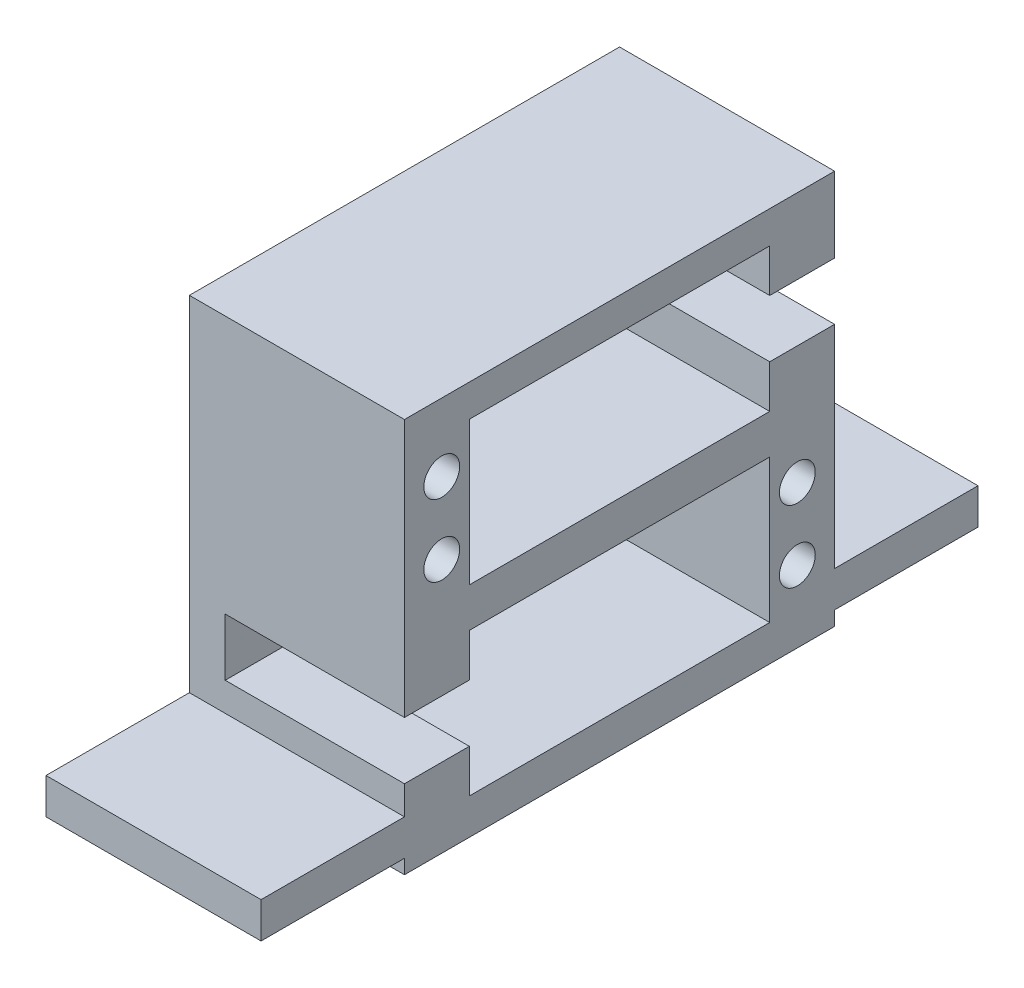
ISO-10303-21;
HEADER;
FILE_DESCRIPTION(('STEP AP214'),'2;1');
FILE_NAME('part.step','',(''),(''),'','','');
FILE_SCHEMA(('AUTOMOTIVE_DESIGN { 1 0 10303 214 1 1 1 1 }'));
ENDSEC;
DATA;
#1=APPLICATION_CONTEXT('core data for automotive mechanical design processes');
#2=APPLICATION_PROTOCOL_DEFINITION('international standard','automotive_design',2000,#1);
#3=PRODUCT_CONTEXT('',#1,'mechanical');
#4=PRODUCT('Part','Part','',(#3));
#5=PRODUCT_RELATED_PRODUCT_CATEGORY('part','',(#4));
#6=PRODUCT_DEFINITION_FORMATION('','',#4);
#7=PRODUCT_DEFINITION_CONTEXT('part definition',#1,'design');
#8=PRODUCT_DEFINITION('design','',#6,#7);
#9=PRODUCT_DEFINITION_SHAPE('','',#8);
#10=(LENGTH_UNIT() NAMED_UNIT(*) SI_UNIT(.MILLI.,.METRE.));
#11=(NAMED_UNIT(*) PLANE_ANGLE_UNIT() SI_UNIT($,.RADIAN.));
#12=(NAMED_UNIT(*) SI_UNIT($,.STERADIAN.) SOLID_ANGLE_UNIT());
#13=UNCERTAINTY_MEASURE_WITH_UNIT(LENGTH_MEASURE(1.E-05),#10,'distance_accuracy_value','');
#14=(GEOMETRIC_REPRESENTATION_CONTEXT(3) GLOBAL_UNCERTAINTY_ASSIGNED_CONTEXT((#13)) GLOBAL_UNIT_ASSIGNED_CONTEXT((#10,
#11,#12)) REPRESENTATION_CONTEXT('',''));
#15=CARTESIAN_POINT('',(0.,0.,0.));
#16=DIRECTION('',(0.,0.,1.));
#17=DIRECTION('',(1.,0.,0.));
#18=AXIS2_PLACEMENT_3D('',#15,#16,#17);
#19=CARTESIAN_POINT('',(4.12598425196847,25.,13.5877952755906));
#20=DIRECTION('',(0.,0.,1.));
#21=DIRECTION('',(0.,-1.,0.));
#22=AXIS2_PLACEMENT_3D('',#19,#20,#21);
#23=PLANE('',#22);
#24=DIRECTION('',(-1.,0.,0.));
#25=VECTOR('',#24,1.);
#26=CARTESIAN_POINT('',(29.1259842519685,5.,13.5877952755906));
#27=LINE('',#26,#25);
#28=CARTESIAN_POINT('',(29.1259842519685,5.,13.5877952755906));
#29=VERTEX_POINT('',#28);
#30=CARTESIAN_POINT('',(4.12598425196847,5.,13.5877952755906));
#31=VERTEX_POINT('',#30);
#32=EDGE_CURVE('E69',#29,#31,#27,.T.);
#33=ORIENTED_EDGE('',*,*,#32,.T.);
#34=DIRECTION('',(0.,-1.,0.));
#35=VECTOR('',#34,1.);
#36=CARTESIAN_POINT('',(4.12598425196847,25.,13.5877952755906));
#37=LINE('',#36,#35);
#38=CARTESIAN_POINT('',(4.12598425196847,11.,13.5877952755906));
#39=VERTEX_POINT('',#38);
#40=EDGE_CURVE('E475',#39,#31,#37,.T.);
#41=ORIENTED_EDGE('',*,*,#40,.F.);
#42=DIRECTION('',(1.,0.,0.));
#43=VECTOR('',#42,1.);
#44=CARTESIAN_POINT('',(4.12598425196847,11.,13.5877952755906));
#45=LINE('',#44,#43);
#46=CARTESIAN_POINT('',(29.1259842519685,11.,13.5877952755906));
#47=VERTEX_POINT('',#46);
#48=EDGE_CURVE('E395',#39,#47,#45,.T.);
#49=ORIENTED_EDGE('',*,*,#48,.T.);
#50=DIRECTION('',(0.,1.,0.));
#51=VECTOR('',#50,1.);
#52=CARTESIAN_POINT('',(29.1259842519685,25.,13.5877952755906));
#53=LINE('',#52,#51);
#54=EDGE_CURVE('E335',#29,#47,#53,.T.);
#55=ORIENTED_EDGE('',*,*,#54,.F.);
#56=EDGE_LOOP('',(#33,#41,#49,#55));
#57=FACE_BOUND('',#56,.T.);
#58=ADVANCED_FACE('F45',(#57),#23,.F.);
#59=CARTESIAN_POINT('',(4.12598425196847,25.,-28.3122047244094));
#60=DIRECTION('',(0.,0.,-1.));
#61=DIRECTION('',(-1.,0.,0.));
#62=AXIS2_PLACEMENT_3D('',#59,#60,#61);
#63=PLANE('',#62);
#64=DIRECTION('',(-1.,0.,0.));
#65=VECTOR('',#64,1.);
#66=CARTESIAN_POINT('',(29.1259842519685,5.,-28.3122047244094));
#67=LINE('',#66,#65);
#68=CARTESIAN_POINT('',(29.1259842519685,5.,-28.3122047244094));
#69=VERTEX_POINT('',#68);
#70=CARTESIAN_POINT('',(4.12598425196847,5.,-28.3122047244094));
#71=VERTEX_POINT('',#70);
#72=EDGE_CURVE('E559',#69,#71,#67,.T.);
#73=ORIENTED_EDGE('',*,*,#72,.F.);
#74=DIRECTION('',(0.,-1.,0.));
#75=VECTOR('',#74,1.);
#76=CARTESIAN_POINT('',(29.1259842519685,25.,-28.3122047244094));
#77=LINE('',#76,#75);
#78=CARTESIAN_POINT('',(29.1259842519685,25.,-28.3122047244094));
#79=VERTEX_POINT('',#78);
#80=EDGE_CURVE('E338',#79,#69,#77,.T.);
#81=ORIENTED_EDGE('',*,*,#80,.F.);
#82=DIRECTION('',(1.,0.,0.));
#83=VECTOR('',#82,1.);
#84=CARTESIAN_POINT('',(4.12598425196847,25.,-28.3122047244094));
#85=LINE('',#84,#83);
#86=CARTESIAN_POINT('',(4.12598425196847,25.,-28.3122047244094));
#87=VERTEX_POINT('',#86);
#88=EDGE_CURVE('E461',#87,#79,#85,.T.);
#89=ORIENTED_EDGE('',*,*,#88,.F.);
#90=DIRECTION('',(0.,1.,0.));
#91=VECTOR('',#90,1.);
#92=CARTESIAN_POINT('',(4.12598425196847,25.,-28.3122047244094));
#93=LINE('',#92,#91);
#94=EDGE_CURVE('E472',#71,#87,#93,.T.);
#95=ORIENTED_EDGE('',*,*,#94,.F.);
#96=EDGE_LOOP('',(#73,#81,#89,#95));
#97=FACE_BOUND('',#96,.T.);
#98=ADVANCED_FACE('F557',(#97),#63,.F.);
#99=CARTESIAN_POINT('',(4.12598425196847,0.,0.));
#100=DIRECTION('',(1.,0.,0.));
#101=DIRECTION('',(0.,0.,-1.));
#102=AXIS2_PLACEMENT_3D('',#99,#100,#101);
#103=PLANE('',#102);
#104=ORIENTED_EDGE('',*,*,#40,.T.);
#105=DIRECTION('',(0.,0.,1.));
#106=VECTOR('',#105,1.);
#107=CARTESIAN_POINT('',(4.12598425196847,5.,13.5877952755906));
#108=LINE('',#107,#106);
#109=EDGE_CURVE('E61',#71,#31,#108,.T.);
#110=ORIENTED_EDGE('',*,*,#109,.F.);
#111=ORIENTED_EDGE('',*,*,#94,.T.);
#112=DIRECTION('',(0.,0.,1.));
#113=VECTOR('',#112,1.);
#114=CARTESIAN_POINT('',(4.12598425196847,25.,13.5877952755906));
#115=LINE('',#114,#113);
#116=CARTESIAN_POINT('',(4.12598425196847,25.,13.5877952755906));
#117=VERTEX_POINT('',#116);
#118=EDGE_CURVE('E465',#87,#117,#115,.T.);
#119=ORIENTED_EDGE('',*,*,#118,.T.);
#120=CARTESIAN_POINT('',(4.12598425196847,19.,13.5877952755906));
#121=VERTEX_POINT('',#120);
#122=EDGE_CURVE('E431',#117,#121,#37,.T.);
#123=ORIENTED_EDGE('',*,*,#122,.T.);
#124=DIRECTION('',(0.,0.,1.));
#125=VECTOR('',#124,1.);
#126=CARTESIAN_POINT('',(4.12598425196847,19.,22.6377952755906));
#127=LINE('',#126,#125);
#128=CARTESIAN_POINT('',(4.12598425196847,19.,22.6377952755906));
#129=VERTEX_POINT('',#128);
#130=EDGE_CURVE('E381',#121,#129,#127,.T.);
#131=ORIENTED_EDGE('',*,*,#130,.T.);
#132=DIRECTION('',(0.,-1.,0.));
#133=VECTOR('',#132,1.);
#134=CARTESIAN_POINT('',(4.12598425196847,19.,22.6377952755906));
#135=LINE('',#134,#133);
#136=CARTESIAN_POINT('',(4.12598425196847,11.,22.6377952755906));
#137=VERTEX_POINT('',#136);
#138=EDGE_CURVE('E373',#129,#137,#135,.T.);
#139=ORIENTED_EDGE('',*,*,#138,.T.);
#140=DIRECTION('',(0.,0.,-1.));
#141=VECTOR('',#140,1.);
#142=CARTESIAN_POINT('',(4.12598425196847,11.,22.6377952755906));
#143=LINE('',#142,#141);
#144=EDGE_CURVE('E377',#137,#39,#143,.T.);
#145=ORIENTED_EDGE('',*,*,#144,.T.);
#146=EDGE_LOOP('',(#104,#110,#111,#119,#123,#131,#139,#145));
#147=FACE_BOUND('',#146,.T.);
#148=ADVANCED_FACE('F539',(#147),#103,.T.);
#149=CARTESIAN_POINT('',(-0.874015748031524,55.,22.6377952755906));
#150=DIRECTION('',(0.,0.,-1.));
#151=DIRECTION('',(-1.,0.,0.));
#152=AXIS2_PLACEMENT_3D('',#149,#150,#151);
#153=PLANE('',#152);
#154=DIRECTION('',(0.,-1.,0.));
#155=VECTOR('',#154,1.);
#156=CARTESIAN_POINT('',(-0.874015748031524,55.,22.6377952755906));
#157=LINE('',#156,#155);
#158=CARTESIAN_POINT('',(-0.874015748031524,55.,22.6377952755906));
#159=VERTEX_POINT('',#158);
#160=CARTESIAN_POINT('',(-0.874015748031524,7.,22.6377952755906));
#161=VERTEX_POINT('',#160);
#162=EDGE_CURVE('E54',#159,#161,#157,.T.);
#163=ORIENTED_EDGE('',*,*,#162,.T.);
#164=DIRECTION('',(1.,0.,0.));
#165=VECTOR('',#164,1.);
#166=CARTESIAN_POINT('',(-0.874015748031524,7.,22.6377952755906));
#167=LINE('',#166,#165);
#168=CARTESIAN_POINT('',(29.1259842519685,7.,22.6377952755906));
#169=VERTEX_POINT('',#168);
#170=EDGE_CURVE('E314',#161,#169,#167,.T.);
#171=ORIENTED_EDGE('',*,*,#170,.T.);
#172=DIRECTION('',(0.,-1.,0.));
#173=VECTOR('',#172,1.);
#174=CARTESIAN_POINT('',(29.1259842519685,55.,22.6377952755906));
#175=LINE('',#174,#173);
#176=CARTESIAN_POINT('',(29.1259842519685,11.,22.6377952755906));
#177=VERTEX_POINT('',#176);
#178=EDGE_CURVE('E323',#177,#169,#175,.T.);
#179=ORIENTED_EDGE('',*,*,#178,.F.);
#180=DIRECTION('',(1.,0.,0.));
#181=VECTOR('',#180,1.);
#182=CARTESIAN_POINT('',(4.12598425196847,11.,22.6377952755906));
#183=LINE('',#182,#181);
#184=EDGE_CURVE('E385',#137,#177,#183,.T.);
#185=ORIENTED_EDGE('',*,*,#184,.F.);
#186=ORIENTED_EDGE('',*,*,#138,.F.);
#187=DIRECTION('',(1.,0.,0.));
#188=VECTOR('',#187,1.);
#189=CARTESIAN_POINT('',(4.12598425196847,19.,22.6377952755906));
#190=LINE('',#189,#188);
#191=CARTESIAN_POINT('',(29.1259842519685,19.,22.6377952755906));
#192=VERTEX_POINT('',#191);
#193=EDGE_CURVE('E386',#129,#192,#190,.T.);
#194=ORIENTED_EDGE('',*,*,#193,.T.);
#195=CARTESIAN_POINT('',(29.1259842519685,55.,22.6377952755906));
#196=VERTEX_POINT('',#195);
#197=EDGE_CURVE('E319',#196,#192,#175,.T.);
#198=ORIENTED_EDGE('',*,*,#197,.F.);
#199=DIRECTION('',(1.,0.,0.));
#200=VECTOR('',#199,1.);
#201=CARTESIAN_POINT('',(-0.874015748031524,55.,22.6377952755906));
#202=LINE('',#201,#200);
#203=EDGE_CURVE('E483',#159,#196,#202,.T.);
#204=ORIENTED_EDGE('',*,*,#203,.F.);
#205=EDGE_LOOP('',(#163,#171,#179,#185,#186,#194,#198,#204));
#206=FACE_BOUND('',#205,.T.);
#207=ADVANCED_FACE('F534',(#206),#153,.F.);
#208=CARTESIAN_POINT('',(-0.874015748031532,55.,-37.3622047244094));
#209=DIRECTION('',(0.,0.,1.));
#210=DIRECTION('',(1.,0.,0.));
#211=AXIS2_PLACEMENT_3D('',#208,#209,#210);
#212=PLANE('',#211);
#213=DIRECTION('',(0.,1.,0.));
#214=VECTOR('',#213,1.);
#215=CARTESIAN_POINT('',(29.1259842519685,55.,-37.3622047244094));
#216=LINE('',#215,#214);
#217=CARTESIAN_POINT('',(29.1259842519685,7.,-37.3622047244094));
#218=VERTEX_POINT('',#217);
#219=CARTESIAN_POINT('',(29.1259842519685,36.5,-37.3622047244094));
#220=VERTEX_POINT('',#219);
#221=EDGE_CURVE('E332',#218,#220,#216,.T.);
#222=ORIENTED_EDGE('',*,*,#221,.F.);
#223=DIRECTION('',(-1.,0.,0.));
#224=VECTOR('',#223,1.);
#225=CARTESIAN_POINT('',(-0.874015748031532,7.,-37.3622047244094));
#226=LINE('',#225,#224);
#227=CARTESIAN_POINT('',(-0.874015748031524,7.,-37.3622047244094));
#228=VERTEX_POINT('',#227);
#229=EDGE_CURVE('E310',#218,#228,#226,.T.);
#230=ORIENTED_EDGE('',*,*,#229,.T.);
#231=DIRECTION('',(0.,-1.,0.));
#232=VECTOR('',#231,1.);
#233=CARTESIAN_POINT('',(-0.874015748031532,55.,-37.3622047244094));
#234=LINE('',#233,#232);
#235=CARTESIAN_POINT('',(-0.874015748031532,55.,-37.3622047244094));
#236=VERTEX_POINT('',#235);
#237=EDGE_CURVE('E501',#236,#228,#234,.T.);
#238=ORIENTED_EDGE('',*,*,#237,.F.);
#239=DIRECTION('',(-1.,0.,0.));
#240=VECTOR('',#239,1.);
#241=CARTESIAN_POINT('',(-0.874015748031532,55.,-37.3622047244094));
#242=LINE('',#241,#240);
#243=CARTESIAN_POINT('',(29.1259842519685,55.,-37.3622047244094));
#244=VERTEX_POINT('',#243);
#245=EDGE_CURVE('E488',#244,#236,#242,.T.);
#246=ORIENTED_EDGE('',*,*,#245,.F.);
#247=CARTESIAN_POINT('',(29.1259842519685,44.5,-37.3622047244094));
#248=VERTEX_POINT('',#247);
#249=EDGE_CURVE('E326',#248,#244,#216,.T.);
#250=ORIENTED_EDGE('',*,*,#249,.F.);
#251=DIRECTION('',(1.,0.,0.));
#252=VECTOR('',#251,1.);
#253=CARTESIAN_POINT('',(4.12598425196847,44.5,-37.3622047244094));
#254=LINE('',#253,#252);
#255=CARTESIAN_POINT('',(4.12598425196847,44.5,-37.3622047244094));
#256=VERTEX_POINT('',#255);
#257=EDGE_CURVE('E411',#256,#248,#254,.T.);
#258=ORIENTED_EDGE('',*,*,#257,.F.);
#259=DIRECTION('',(0.,1.,0.));
#260=VECTOR('',#259,1.);
#261=CARTESIAN_POINT('',(4.12598425196847,44.5,-37.3622047244094));
#262=LINE('',#261,#260);
#263=CARTESIAN_POINT('',(4.12598425196847,36.5,-37.3622047244094));
#264=VERTEX_POINT('',#263);
#265=EDGE_CURVE('E420',#264,#256,#262,.T.);
#266=ORIENTED_EDGE('',*,*,#265,.F.);
#267=DIRECTION('',(1.,0.,0.));
#268=VECTOR('',#267,1.);
#269=CARTESIAN_POINT('',(4.12598425196847,36.5,-37.3622047244094));
#270=LINE('',#269,#268);
#271=EDGE_CURVE('E407',#264,#220,#270,.T.);
#272=ORIENTED_EDGE('',*,*,#271,.T.);
#273=EDGE_LOOP('',(#222,#230,#238,#246,#250,#258,#266,#272));
#274=FACE_BOUND('',#273,.T.);
#275=ADVANCED_FACE('F618',(#274),#212,.F.);
#276=DIRECTION('',(0.,1.,0.));
#277=VECTOR('',#276,1.);
#278=CARTESIAN_POINT('',(29.1259842519685,25.,13.5877952755906));
#279=LINE('',#278,#277);
#280=CARTESIAN_POINT('',(29.1259842519685,19.,13.5877952755906));
#281=VERTEX_POINT('',#280);
#282=CARTESIAN_POINT('',(29.1259842519685,25.,13.5877952755906));
#283=VERTEX_POINT('',#282);
#284=EDGE_CURVE('E345',#281,#283,#279,.T.);
#285=ORIENTED_EDGE('',*,*,#284,.F.);
#286=DIRECTION('',(1.,0.,0.));
#287=VECTOR('',#286,1.);
#288=CARTESIAN_POINT('',(4.12598425196847,19.,13.5877952755906));
#289=LINE('',#288,#287);
#290=EDGE_CURVE('E391',#121,#281,#289,.T.);
#291=ORIENTED_EDGE('',*,*,#290,.F.);
#292=ORIENTED_EDGE('',*,*,#122,.F.);
#293=DIRECTION('',(1.,0.,0.));
#294=VECTOR('',#293,1.);
#295=CARTESIAN_POINT('',(4.12598425196847,25.,13.5877952755906));
#296=LINE('',#295,#294);
#297=EDGE_CURVE('E390',#117,#283,#296,.T.);
#298=ORIENTED_EDGE('',*,*,#297,.T.);
#299=EDGE_LOOP('',(#285,#291,#292,#298));
#300=FACE_BOUND('',#299,.T.);
#301=ADVANCED_FACE('F548',(#300),#23,.F.);
#302=CARTESIAN_POINT('',(4.12598425196847,50.5,-28.3122047244094));
#303=DIRECTION('',(0.,0.,-1.));
#304=DIRECTION('',(-1.,0.,0.));
#305=AXIS2_PLACEMENT_3D('',#302,#303,#304);
#306=PLANE('',#305);
#307=DIRECTION('',(0.,-1.,0.));
#308=VECTOR('',#307,1.);
#309=CARTESIAN_POINT('',(29.1259842519685,50.5,-28.3122047244094));
#310=LINE('',#309,#308);
#311=CARTESIAN_POINT('',(29.1259842519685,50.5,-28.3122047244094));
#312=VERTEX_POINT('',#311);
#313=CARTESIAN_POINT('',(29.1259842519685,44.5,-28.3122047244094));
#314=VERTEX_POINT('',#313);
#315=EDGE_CURVE('E366',#312,#314,#310,.T.);
#316=ORIENTED_EDGE('',*,*,#315,.F.);
#317=DIRECTION('',(1.,0.,0.));
#318=VECTOR('',#317,1.);
#319=CARTESIAN_POINT('',(4.12598425196847,50.5,-28.3122047244094));
#320=LINE('',#319,#318);
#321=CARTESIAN_POINT('',(4.12598425196847,50.5,-28.3122047244094));
#322=VERTEX_POINT('',#321);
#323=EDGE_CURVE('E450',#322,#312,#320,.T.);
#324=ORIENTED_EDGE('',*,*,#323,.F.);
#325=DIRECTION('',(0.,1.,0.));
#326=VECTOR('',#325,1.);
#327=CARTESIAN_POINT('',(4.12598425196847,50.5,-28.3122047244094));
#328=LINE('',#327,#326);
#329=CARTESIAN_POINT('',(4.12598425196847,44.5,-28.3122047244094));
#330=VERTEX_POINT('',#329);
#331=EDGE_CURVE('E435',#330,#322,#328,.T.);
#332=ORIENTED_EDGE('',*,*,#331,.F.);
#333=DIRECTION('',(1.,0.,0.));
#334=VECTOR('',#333,1.);
#335=CARTESIAN_POINT('',(4.12598425196847,44.5,-28.3122047244094));
#336=LINE('',#335,#334);
#337=EDGE_CURVE('E372',#330,#314,#336,.T.);
#338=ORIENTED_EDGE('',*,*,#337,.T.);
#339=EDGE_LOOP('',(#316,#324,#332,#338));
#340=FACE_BOUND('',#339,.T.);
#341=ADVANCED_FACE('F617',(#340),#306,.F.);
#342=CARTESIAN_POINT('',(29.1259842519685,2.,22.6377952755906));
#343=VERTEX_POINT('',#342);
#344=CARTESIAN_POINT('',(29.1259842519685,0.,22.6377952755906));
#345=VERTEX_POINT('',#344);
#346=EDGE_CURVE('E318',#343,#345,#175,.T.);
#347=ORIENTED_EDGE('',*,*,#346,.F.);
#348=DIRECTION('',(-1.,0.,0.));
#349=VECTOR('',#348,1.);
#350=CARTESIAN_POINT('',(-0.874015748031524,2.,22.6377952755906));
#351=LINE('',#350,#349);
#352=CARTESIAN_POINT('',(-0.874015748031524,2.,22.6377952755906));
#353=VERTEX_POINT('',#352);
#354=EDGE_CURVE('E307',#343,#353,#351,.T.);
#355=ORIENTED_EDGE('',*,*,#354,.T.);
#356=CARTESIAN_POINT('',(-0.874015748031524,0.,22.6377952755906));
#357=VERTEX_POINT('',#356);
#358=EDGE_CURVE('E237',#353,#357,#157,.T.);
#359=ORIENTED_EDGE('',*,*,#358,.T.);
#360=DIRECTION('',(1.,0.,0.));
#361=VECTOR('',#360,1.);
#362=CARTESIAN_POINT('',(-0.874015748031524,0.,22.6377952755906));
#363=LINE('',#362,#361);
#364=EDGE_CURVE('E494',#357,#345,#363,.T.);
#365=ORIENTED_EDGE('',*,*,#364,.T.);
#366=EDGE_LOOP('',(#347,#355,#359,#365));
#367=FACE_BOUND('',#366,.T.);
#368=ADVANCED_FACE('F512',(#367),#153,.F.);
#369=CARTESIAN_POINT('',(-0.874015748031524,2.,-37.3622047244094));
#370=VERTEX_POINT('',#369);
#371=CARTESIAN_POINT('',(-0.874015748031532,0.,-37.3622047244094));
#372=VERTEX_POINT('',#371);
#373=EDGE_CURVE('E491',#370,#372,#234,.T.);
#374=ORIENTED_EDGE('',*,*,#373,.F.);
#375=DIRECTION('',(1.,0.,0.));
#376=VECTOR('',#375,1.);
#377=CARTESIAN_POINT('',(-0.874015748031532,2.,-37.3622047244094));
#378=LINE('',#377,#376);
#379=CARTESIAN_POINT('',(29.1259842519685,2.,-37.3622047244094));
#380=VERTEX_POINT('',#379);
#381=EDGE_CURVE('E292',#370,#380,#378,.T.);
#382=ORIENTED_EDGE('',*,*,#381,.T.);
#383=CARTESIAN_POINT('',(29.1259842519685,0.,-37.3622047244094));
#384=VERTEX_POINT('',#383);
#385=EDGE_CURVE('E327',#384,#380,#216,.T.);
#386=ORIENTED_EDGE('',*,*,#385,.F.);
#387=DIRECTION('',(-1.,0.,0.));
#388=VECTOR('',#387,1.);
#389=CARTESIAN_POINT('',(-0.874015748031532,0.,-37.3622047244094));
#390=LINE('',#389,#388);
#391=EDGE_CURVE('E484',#384,#372,#390,.T.);
#392=ORIENTED_EDGE('',*,*,#391,.T.);
#393=EDGE_LOOP('',(#374,#382,#386,#392));
#394=FACE_BOUND('',#393,.T.);
#395=ADVANCED_FACE('F522',(#394),#212,.F.);
#396=CARTESIAN_POINT('',(0.,55.,0.));
#397=DIRECTION('',(0.,1.,0.));
#398=DIRECTION('',(0.,0.,1.));
#399=AXIS2_PLACEMENT_3D('',#396,#397,#398);
#400=PLANE('',#399);
#401=ORIENTED_EDGE('',*,*,#203,.T.);
#402=DIRECTION('',(0.,0.,1.));
#403=VECTOR('',#402,1.);
#404=CARTESIAN_POINT('',(29.1259842519685,55.,22.6377952755906));
#405=LINE('',#404,#403);
#406=EDGE_CURVE('E331',#244,#196,#405,.T.);
#407=ORIENTED_EDGE('',*,*,#406,.F.);
#408=ORIENTED_EDGE('',*,*,#245,.T.);
#409=DIRECTION('',(0.,0.,1.));
#410=VECTOR('',#409,1.);
#411=CARTESIAN_POINT('',(-0.874015748031532,55.,-37.3622047244094));
#412=LINE('',#411,#410);
#413=EDGE_CURVE('E479',#236,#159,#412,.T.);
#414=ORIENTED_EDGE('',*,*,#413,.T.);
#415=EDGE_LOOP('',(#401,#407,#408,#414));
#416=FACE_BOUND('',#415,.T.);
#417=ADVANCED_FACE('F636',(#416),#400,.T.);
#418=CARTESIAN_POINT('',(0.,0.,0.));
#419=DIRECTION('',(0.,1.,0.));
#420=DIRECTION('',(0.,0.,1.));
#421=AXIS2_PLACEMENT_3D('',#418,#419,#420);
#422=PLANE('',#421);
#423=DIRECTION('',(0.,0.,-1.));
#424=VECTOR('',#423,1.);
#425=CARTESIAN_POINT('',(29.1259842519685,0.,22.6377952755906));
#426=LINE('',#425,#424);
#427=EDGE_CURVE('E322',#345,#384,#426,.T.);
#428=ORIENTED_EDGE('',*,*,#427,.F.);
#429=ORIENTED_EDGE('',*,*,#364,.F.);
#430=DIRECTION('',(0.,0.,1.));
#431=VECTOR('',#430,1.);
#432=CARTESIAN_POINT('',(-0.874015748031532,0.,-37.3622047244094));
#433=LINE('',#432,#431);
#434=EDGE_CURVE('E449',#372,#357,#433,.T.);
#435=ORIENTED_EDGE('',*,*,#434,.F.);
#436=ORIENTED_EDGE('',*,*,#391,.F.);
#437=EDGE_LOOP('',(#428,#429,#435,#436));
#438=FACE_BOUND('',#437,.T.);
#439=ADVANCED_FACE('F516',(#438),#422,.F.);
#440=CARTESIAN_POINT('',(4.12598425196847,25.,13.5877952755906));
#441=DIRECTION('',(0.,1.,0.));
#442=DIRECTION('',(0.,0.,1.));
#443=AXIS2_PLACEMENT_3D('',#440,#441,#442);
#444=PLANE('',#443);
#445=DIRECTION('',(0.,0.,-1.));
#446=VECTOR('',#445,1.);
#447=CARTESIAN_POINT('',(29.1259842519685,25.,13.5877952755906));
#448=LINE('',#447,#446);
#449=EDGE_CURVE('E342',#283,#79,#448,.T.);
#450=ORIENTED_EDGE('',*,*,#449,.F.);
#451=ORIENTED_EDGE('',*,*,#297,.F.);
#452=ORIENTED_EDGE('',*,*,#118,.F.);
#453=ORIENTED_EDGE('',*,*,#88,.T.);
#454=EDGE_LOOP('',(#450,#451,#452,#453));
#455=FACE_BOUND('',#454,.T.);
#456=ADVANCED_FACE('F552',(#455),#444,.F.);
#457=CARTESIAN_POINT('',(4.12598425196847,50.5,13.5877952755906));
#458=DIRECTION('',(0.,0.,1.));
#459=DIRECTION('',(0.,-1.,0.));
#460=AXIS2_PLACEMENT_3D('',#457,#458,#459);
#461=PLANE('',#460);
#462=DIRECTION('',(0.,1.,0.));
#463=VECTOR('',#462,1.);
#464=CARTESIAN_POINT('',(29.1259842519685,50.5,13.5877952755906));
#465=LINE('',#464,#463);
#466=CARTESIAN_POINT('',(29.1259842519685,30.5,13.5877952755906));
#467=VERTEX_POINT('',#466);
#468=CARTESIAN_POINT('',(29.1259842519685,50.5,13.5877952755906));
#469=VERTEX_POINT('',#468);
#470=EDGE_CURVE('E360',#467,#469,#465,.T.);
#471=ORIENTED_EDGE('',*,*,#470,.F.);
#472=DIRECTION('',(1.,0.,0.));
#473=VECTOR('',#472,1.);
#474=CARTESIAN_POINT('',(4.12598425196847,30.5,13.5877952755906));
#475=LINE('',#474,#473);
#476=CARTESIAN_POINT('',(4.12598425196847,30.5,13.5877952755906));
#477=VERTEX_POINT('',#476);
#478=EDGE_CURVE('E444',#477,#467,#475,.T.);
#479=ORIENTED_EDGE('',*,*,#478,.F.);
#480=DIRECTION('',(0.,-1.,0.));
#481=VECTOR('',#480,1.);
#482=CARTESIAN_POINT('',(4.12598425196847,50.5,13.5877952755906));
#483=LINE('',#482,#481);
#484=CARTESIAN_POINT('',(4.12598425196847,50.5,13.5877952755906));
#485=VERTEX_POINT('',#484);
#486=EDGE_CURVE('E426',#485,#477,#483,.T.);
#487=ORIENTED_EDGE('',*,*,#486,.F.);
#488=DIRECTION('',(1.,0.,0.));
#489=VECTOR('',#488,1.);
#490=CARTESIAN_POINT('',(4.12598425196847,50.5,13.5877952755906));
#491=LINE('',#490,#489);
#492=EDGE_CURVE('E445',#485,#469,#491,.T.);
#493=ORIENTED_EDGE('',*,*,#492,.T.);
#494=EDGE_LOOP('',(#471,#479,#487,#493));
#495=FACE_BOUND('',#494,.T.);
#496=ADVANCED_FACE('F883',(#495),#461,.F.);
#497=CARTESIAN_POINT('',(4.12598425196847,50.5,13.5877952755906));
#498=DIRECTION('',(0.,1.,0.));
#499=DIRECTION('',(0.,0.,1.));
#500=AXIS2_PLACEMENT_3D('',#497,#498,#499);
#501=PLANE('',#500);
#502=DIRECTION('',(0.,0.,-1.));
#503=VECTOR('',#502,1.);
#504=CARTESIAN_POINT('',(29.1259842519685,50.5,13.5877952755906));
#505=LINE('',#504,#503);
#506=EDGE_CURVE('E363',#469,#312,#505,.T.);
#507=ORIENTED_EDGE('',*,*,#506,.F.);
#508=ORIENTED_EDGE('',*,*,#492,.F.);
#509=DIRECTION('',(0.,0.,1.));
#510=VECTOR('',#509,1.);
#511=CARTESIAN_POINT('',(4.12598425196847,50.5,13.5877952755906));
#512=LINE('',#511,#510);
#513=EDGE_CURVE('E440',#322,#485,#512,.T.);
#514=ORIENTED_EDGE('',*,*,#513,.F.);
#515=ORIENTED_EDGE('',*,*,#323,.T.);
#516=EDGE_LOOP('',(#507,#508,#514,#515));
#517=FACE_BOUND('',#516,.T.);
#518=ADVANCED_FACE('F887',(#517),#501,.F.);
#519=DIRECTION('',(0.,-1.,0.));
#520=VECTOR('',#519,1.);
#521=CARTESIAN_POINT('',(29.1259842519685,50.5,-28.3122047244094));
#522=LINE('',#521,#520);
#523=CARTESIAN_POINT('',(29.1259842519685,36.5,-28.3122047244094));
#524=VERTEX_POINT('',#523);
#525=CARTESIAN_POINT('',(29.1259842519685,30.5,-28.3122047244094));
#526=VERTEX_POINT('',#525);
#527=EDGE_CURVE('E354',#524,#526,#522,.T.);
#528=ORIENTED_EDGE('',*,*,#527,.F.);
#529=DIRECTION('',(1.,0.,0.));
#530=VECTOR('',#529,1.);
#531=CARTESIAN_POINT('',(4.12598425196847,36.5,-28.3122047244094));
#532=LINE('',#531,#530);
#533=CARTESIAN_POINT('',(4.12598425196847,36.5,-28.3122047244094));
#534=VERTEX_POINT('',#533);
#535=EDGE_CURVE('E402',#534,#524,#532,.T.);
#536=ORIENTED_EDGE('',*,*,#535,.F.);
#537=CARTESIAN_POINT('',(4.12598425196847,30.5,-28.3122047244094));
#538=VERTEX_POINT('',#537);
#539=EDGE_CURVE('E436',#538,#534,#328,.T.);
#540=ORIENTED_EDGE('',*,*,#539,.F.);
#541=DIRECTION('',(1.,0.,0.));
#542=VECTOR('',#541,1.);
#543=CARTESIAN_POINT('',(4.12598425196847,30.5,-28.3122047244094));
#544=LINE('',#543,#542);
#545=EDGE_CURVE('E454',#538,#526,#544,.T.);
#546=ORIENTED_EDGE('',*,*,#545,.T.);
#547=EDGE_LOOP('',(#528,#536,#540,#546));
#548=FACE_BOUND('',#547,.T.);
#549=ADVANCED_FACE('F625',(#548),#306,.F.);
#550=CARTESIAN_POINT('',(4.12598425196847,30.5,13.5877952755906));
#551=DIRECTION('',(0.,-1.,0.));
#552=DIRECTION('',(0.,0.,-1.));
#553=AXIS2_PLACEMENT_3D('',#550,#551,#552);
#554=PLANE('',#553);
#555=DIRECTION('',(0.,0.,1.));
#556=VECTOR('',#555,1.);
#557=CARTESIAN_POINT('',(29.1259842519685,30.5,13.5877952755906));
#558=LINE('',#557,#556);
#559=EDGE_CURVE('E357',#526,#467,#558,.T.);
#560=ORIENTED_EDGE('',*,*,#559,.F.);
#561=ORIENTED_EDGE('',*,*,#545,.F.);
#562=DIRECTION('',(0.,0.,-1.));
#563=VECTOR('',#562,1.);
#564=CARTESIAN_POINT('',(4.12598425196847,30.5,13.5877952755906));
#565=LINE('',#564,#563);
#566=EDGE_CURVE('E430',#477,#538,#565,.T.);
#567=ORIENTED_EDGE('',*,*,#566,.F.);
#568=ORIENTED_EDGE('',*,*,#478,.T.);
#569=EDGE_LOOP('',(#560,#561,#567,#568));
#570=FACE_BOUND('',#569,.T.);
#571=ADVANCED_FACE('F880',(#570),#554,.F.);
#572=CARTESIAN_POINT('',(4.12598425196847,44.5,-28.3122047244094));
#573=DIRECTION('',(0.,1.,0.));
#574=DIRECTION('',(0.,0.,1.));
#575=AXIS2_PLACEMENT_3D('',#572,#573,#574);
#576=PLANE('',#575);
#577=DIRECTION('',(0.,0.,-1.));
#578=VECTOR('',#577,1.);
#579=CARTESIAN_POINT('',(29.1259842519685,44.5,-28.3122047244094));
#580=LINE('',#579,#578);
#581=EDGE_CURVE('E369',#314,#248,#580,.T.);
#582=ORIENTED_EDGE('',*,*,#581,.F.);
#583=ORIENTED_EDGE('',*,*,#337,.F.);
#584=DIRECTION('',(0.,0.,1.));
#585=VECTOR('',#584,1.);
#586=CARTESIAN_POINT('',(4.12598425196847,44.5,-28.3122047244094));
#587=LINE('',#586,#585);
#588=EDGE_CURVE('E406',#256,#330,#587,.T.);
#589=ORIENTED_EDGE('',*,*,#588,.F.);
#590=ORIENTED_EDGE('',*,*,#257,.T.);
#591=EDGE_LOOP('',(#582,#583,#589,#590));
#592=FACE_BOUND('',#591,.T.);
#593=ADVANCED_FACE('F893',(#592),#576,.F.);
#594=CARTESIAN_POINT('',(4.12598425196847,36.5,-28.3122047244094));
#595=DIRECTION('',(0.,-1.,0.));
#596=DIRECTION('',(0.,0.,-1.));
#597=AXIS2_PLACEMENT_3D('',#594,#595,#596);
#598=PLANE('',#597);
#599=DIRECTION('',(0.,0.,1.));
#600=VECTOR('',#599,1.);
#601=CARTESIAN_POINT('',(29.1259842519685,36.5,-28.3122047244094));
#602=LINE('',#601,#600);
#603=EDGE_CURVE('E351',#220,#524,#602,.T.);
#604=ORIENTED_EDGE('',*,*,#603,.F.);
#605=ORIENTED_EDGE('',*,*,#271,.F.);
#606=DIRECTION('',(0.,0.,-1.));
#607=VECTOR('',#606,1.);
#608=CARTESIAN_POINT('',(4.12598425196847,36.5,-28.3122047244094));
#609=LINE('',#608,#607);
#610=EDGE_CURVE('E378',#534,#264,#609,.T.);
#611=ORIENTED_EDGE('',*,*,#610,.F.);
#612=ORIENTED_EDGE('',*,*,#535,.T.);
#613=EDGE_LOOP('',(#604,#605,#611,#612));
#614=FACE_BOUND('',#613,.T.);
#615=ADVANCED_FACE('F869',(#614),#598,.F.);
#616=CARTESIAN_POINT('',(4.12598425196847,19.,22.6377952755906));
#617=DIRECTION('',(0.,1.,0.));
#618=DIRECTION('',(0.,0.,1.));
#619=AXIS2_PLACEMENT_3D('',#616,#617,#618);
#620=PLANE('',#619);
#621=DIRECTION('',(0.,0.,-1.));
#622=VECTOR('',#621,1.);
#623=CARTESIAN_POINT('',(29.1259842519685,19.,22.6377952755906));
#624=LINE('',#623,#622);
#625=EDGE_CURVE('E348',#192,#281,#624,.T.);
#626=ORIENTED_EDGE('',*,*,#625,.F.);
#627=ORIENTED_EDGE('',*,*,#193,.F.);
#628=ORIENTED_EDGE('',*,*,#130,.F.);
#629=ORIENTED_EDGE('',*,*,#290,.T.);
#630=EDGE_LOOP('',(#626,#627,#628,#629));
#631=FACE_BOUND('',#630,.T.);
#632=ADVANCED_FACE('F543',(#631),#620,.F.);
#633=CARTESIAN_POINT('',(4.12598425196847,11.,22.6377952755906));
#634=DIRECTION('',(0.,-1.,0.));
#635=DIRECTION('',(0.,0.,-1.));
#636=AXIS2_PLACEMENT_3D('',#633,#634,#635);
#637=PLANE('',#636);
#638=DIRECTION('',(0.,0.,1.));
#639=VECTOR('',#638,1.);
#640=CARTESIAN_POINT('',(29.1259842519685,11.,22.6377952755906));
#641=LINE('',#640,#639);
#642=EDGE_CURVE('E11',#47,#177,#641,.T.);
#643=ORIENTED_EDGE('',*,*,#642,.F.);
#644=ORIENTED_EDGE('',*,*,#48,.F.);
#645=ORIENTED_EDGE('',*,*,#144,.F.);
#646=ORIENTED_EDGE('',*,*,#184,.T.);
#647=EDGE_LOOP('',(#643,#644,#645,#646));
#648=FACE_BOUND('',#647,.T.);
#649=ADVANCED_FACE('F537',(#648),#637,.F.);
#650=CARTESIAN_POINT('',(-0.874015748031532,55.,-37.3622047244094));
#651=DIRECTION('',(1.,0.,0.));
#652=DIRECTION('',(0.,0.,-1.));
#653=AXIS2_PLACEMENT_3D('',#650,#651,#652);
#654=PLANE('',#653);
#655=ORIENTED_EDGE('',*,*,#358,.F.);
#656=DIRECTION('',(0.,0.,1.));
#657=VECTOR('',#656,1.);
#658=CARTESIAN_POINT('',(-0.874015748031524,2.,-57.3622047244094));
#659=LINE('',#658,#657);
#660=CARTESIAN_POINT('',(-0.874015748031524,2.,42.6377952755906));
#661=VERTEX_POINT('',#660);
#662=EDGE_CURVE('E231',#353,#661,#659,.T.);
#663=ORIENTED_EDGE('',*,*,#662,.T.);
#664=DIRECTION('',(0.,-1.,0.));
#665=VECTOR('',#664,1.);
#666=CARTESIAN_POINT('',(-0.874015748031524,7.,42.6377952755906));
#667=LINE('',#666,#665);
#668=CARTESIAN_POINT('',(-0.874015748031524,7.,42.6377952755906));
#669=VERTEX_POINT('',#668);
#670=EDGE_CURVE('E235',#669,#661,#667,.T.);
#671=ORIENTED_EDGE('',*,*,#670,.F.);
#672=DIRECTION('',(0.,0.,1.));
#673=VECTOR('',#672,1.);
#674=CARTESIAN_POINT('',(-0.874015748031524,7.,-57.3622047244094));
#675=LINE('',#674,#673);
#676=EDGE_CURVE('E293',#161,#669,#675,.T.);
#677=ORIENTED_EDGE('',*,*,#676,.F.);
#678=ORIENTED_EDGE('',*,*,#162,.F.);
#679=ORIENTED_EDGE('',*,*,#413,.F.);
#680=ORIENTED_EDGE('',*,*,#237,.T.);
#681=CARTESIAN_POINT('',(-0.874015748031524,7.,-57.3622047244094));
#682=VERTEX_POINT('',#681);
#683=EDGE_CURVE('E289',#682,#228,#675,.T.);
#684=ORIENTED_EDGE('',*,*,#683,.F.);
#685=DIRECTION('',(0.,-1.,0.));
#686=VECTOR('',#685,1.);
#687=CARTESIAN_POINT('',(-0.874015748031524,7.,-57.3622047244094));
#688=LINE('',#687,#686);
#689=CARTESIAN_POINT('',(-0.874015748031524,2.,-57.3622047244094));
#690=VERTEX_POINT('',#689);
#691=EDGE_CURVE('E274',#682,#690,#688,.T.);
#692=ORIENTED_EDGE('',*,*,#691,.T.);
#693=EDGE_CURVE('E241',#690,#370,#659,.T.);
#694=ORIENTED_EDGE('',*,*,#693,.T.);
#695=ORIENTED_EDGE('',*,*,#373,.T.);
#696=ORIENTED_EDGE('',*,*,#434,.T.);
#697=EDGE_LOOP('',(#655,#663,#671,#677,#678,#679,#680,#684,#692,#694,#695,#696));
#698=FACE_BOUND('',#697,.T.);
#699=ADVANCED_FACE('F47',(#698),#654,.F.);
#700=CARTESIAN_POINT('',(4.12598425196847,0.,0.));
#701=DIRECTION('',(1.,0.,0.));
#702=DIRECTION('',(0.,0.,-1.));
#703=AXIS2_PLACEMENT_3D('',#700,#701,#702);
#704=PLANE('',#703);
#705=ORIENTED_EDGE('',*,*,#486,.T.);
#706=ORIENTED_EDGE('',*,*,#566,.T.);
#707=ORIENTED_EDGE('',*,*,#539,.T.);
#708=ORIENTED_EDGE('',*,*,#610,.T.);
#709=ORIENTED_EDGE('',*,*,#265,.T.);
#710=ORIENTED_EDGE('',*,*,#588,.T.);
#711=ORIENTED_EDGE('',*,*,#331,.T.);
#712=ORIENTED_EDGE('',*,*,#513,.T.);
#713=EDGE_LOOP('',(#705,#706,#707,#708,#709,#710,#711,#712));
#714=FACE_BOUND('',#713,.T.);
#715=ADVANCED_FACE('F671',(#714),#704,.T.);
#716=CARTESIAN_POINT('',(29.1259842519685,0.,0.));
#717=DIRECTION('',(1.,0.,0.));
#718=DIRECTION('',(0.,0.,-1.));
#719=AXIS2_PLACEMENT_3D('',#716,#717,#718);
#720=PLANE('',#719);
#721=DIRECTION('',(0.,0.,1.));
#722=VECTOR('',#721,1.);
#723=CARTESIAN_POINT('',(29.1259842519685,5.,13.5877952755906));
#724=LINE('',#723,#722);
#725=EDGE_CURVE('E569',#69,#29,#724,.T.);
#726=ORIENTED_EDGE('',*,*,#725,.T.);
#727=ORIENTED_EDGE('',*,*,#54,.T.);
#728=ORIENTED_EDGE('',*,*,#642,.T.);
#729=ORIENTED_EDGE('',*,*,#178,.T.);
#730=DIRECTION('',(0.,0.,1.));
#731=VECTOR('',#730,1.);
#732=CARTESIAN_POINT('',(29.1259842519685,7.,-57.3622047244094));
#733=LINE('',#732,#731);
#734=CARTESIAN_POINT('',(29.1259842519685,7.,42.6377952755906));
#735=VERTEX_POINT('',#734);
#736=EDGE_CURVE('E298',#169,#735,#733,.T.);
#737=ORIENTED_EDGE('',*,*,#736,.T.);
#738=DIRECTION('',(0.,1.,0.));
#739=VECTOR('',#738,1.);
#740=CARTESIAN_POINT('',(29.1259842519685,7.,42.6377952755906));
#741=LINE('',#740,#739);
#742=CARTESIAN_POINT('',(29.1259842519685,2.,42.6377952755906));
#743=VERTEX_POINT('',#742);
#744=EDGE_CURVE('E253',#743,#735,#741,.T.);
#745=ORIENTED_EDGE('',*,*,#744,.F.);
#746=DIRECTION('',(0.,0.,1.));
#747=VECTOR('',#746,1.);
#748=CARTESIAN_POINT('',(29.1259842519685,2.,-57.3622047244094));
#749=LINE('',#748,#747);
#750=EDGE_CURVE('E248',#343,#743,#749,.T.);
#751=ORIENTED_EDGE('',*,*,#750,.F.);
#752=ORIENTED_EDGE('',*,*,#346,.T.);
#753=ORIENTED_EDGE('',*,*,#427,.T.);
#754=ORIENTED_EDGE('',*,*,#385,.T.);
#755=CARTESIAN_POINT('',(29.1259842519685,2.,-57.3622047244094));
#756=VERTEX_POINT('',#755);
#757=EDGE_CURVE('E299',#756,#380,#749,.T.);
#758=ORIENTED_EDGE('',*,*,#757,.F.);
#759=DIRECTION('',(0.,1.,0.));
#760=VECTOR('',#759,1.);
#761=CARTESIAN_POINT('',(29.1259842519685,7.,-57.3622047244094));
#762=LINE('',#761,#760);
#763=CARTESIAN_POINT('',(29.1259842519685,7.,-57.3622047244094));
#764=VERTEX_POINT('',#763);
#765=EDGE_CURVE('E282',#756,#764,#762,.T.);
#766=ORIENTED_EDGE('',*,*,#765,.T.);
#767=EDGE_CURVE('E294',#764,#218,#733,.T.);
#768=ORIENTED_EDGE('',*,*,#767,.T.);
#769=ORIENTED_EDGE('',*,*,#221,.T.);
#770=ORIENTED_EDGE('',*,*,#603,.T.);
#771=ORIENTED_EDGE('',*,*,#527,.T.);
#772=ORIENTED_EDGE('',*,*,#559,.T.);
#773=ORIENTED_EDGE('',*,*,#470,.T.);
#774=ORIENTED_EDGE('',*,*,#506,.T.);
#775=ORIENTED_EDGE('',*,*,#315,.T.);
#776=ORIENTED_EDGE('',*,*,#581,.T.);
#777=ORIENTED_EDGE('',*,*,#249,.T.);
#778=ORIENTED_EDGE('',*,*,#406,.T.);
#779=ORIENTED_EDGE('',*,*,#197,.T.);
#780=ORIENTED_EDGE('',*,*,#625,.T.);
#781=ORIENTED_EDGE('',*,*,#284,.T.);
#782=ORIENTED_EDGE('',*,*,#449,.T.);
#783=ORIENTED_EDGE('',*,*,#80,.T.);
#784=EDGE_LOOP('',(#726,#727,#728,#729,#737,#745,#751,#752,#753,#754,#758,#766,#768,#769,#770,
#771,#772,#773,#774,#775,#776,#777,#778,#779,#780,#781,#782,#783));
#785=FACE_BOUND('',#784,.T.);
#786=CARTESIAN_POINT('',(29.1259842519685,20.,-32.1622047244094));
#787=DIRECTION('',(1.,0.,0.));
#788=DIRECTION('',(0.,0.,-1.));
#789=AXIS2_PLACEMENT_3D('',#786,#787,#788);
#790=CIRCLE('',#789,2.5);
#791=CARTESIAN_POINT('',(29.1259842519685,20.,-34.6622047244094));
#792=VERTEX_POINT('',#791);
#793=EDGE_CURVE('E577',#792,#792,#790,.T.);
#794=ORIENTED_EDGE('',*,*,#793,.F.);
#795=EDGE_LOOP('',(#794));
#796=FACE_BOUND('',#795,.T.);
#797=CARTESIAN_POINT('',(29.1259842519685,10.,-32.1622047244094));
#798=DIRECTION('',(1.,0.,0.));
#799=DIRECTION('',(0.,0.,-1.));
#800=AXIS2_PLACEMENT_3D('',#797,#798,#799);
#801=CIRCLE('',#800,2.5);
#802=CARTESIAN_POINT('',(29.1259842519685,10.,-34.6622047244094));
#803=VERTEX_POINT('',#802);
#804=EDGE_CURVE('E567',#803,#803,#801,.T.);
#805=ORIENTED_EDGE('',*,*,#804,.F.);
#806=EDGE_LOOP('',(#805));
#807=FACE_BOUND('',#806,.T.);
#808=CARTESIAN_POINT('',(29.1259842519685,45.5,17.4377952755906));
#809=DIRECTION('',(1.,0.,0.));
#810=DIRECTION('',(0.,0.,-1.));
#811=AXIS2_PLACEMENT_3D('',#808,#809,#810);
#812=CIRCLE('',#811,2.5);
#813=CARTESIAN_POINT('',(29.1259842519685,45.5,14.9377952755906));
#814=VERTEX_POINT('',#813);
#815=EDGE_CURVE('E264',#814,#814,#812,.T.);
#816=ORIENTED_EDGE('',*,*,#815,.F.);
#817=EDGE_LOOP('',(#816));
#818=FACE_BOUND('',#817,.T.);
#819=CARTESIAN_POINT('',(29.1259842519685,35.5,17.4377952755906));
#820=DIRECTION('',(1.,0.,0.));
#821=DIRECTION('',(0.,0.,-1.));
#822=AXIS2_PLACEMENT_3D('',#819,#820,#821);
#823=CIRCLE('',#822,2.5);
#824=CARTESIAN_POINT('',(29.1259842519685,35.5,14.9377952755906));
#825=VERTEX_POINT('',#824);
#826=EDGE_CURVE('E586',#825,#825,#823,.T.);
#827=ORIENTED_EDGE('',*,*,#826,.F.);
#828=EDGE_LOOP('',(#827));
#829=FACE_BOUND('',#828,.T.);
#830=ADVANCED_FACE('F525',(#785,#796,#807,#818,#829),#720,.T.);
#831=CARTESIAN_POINT('',(0.,0.,-57.3622047244094));
#832=DIRECTION('',(0.,0.,1.));
#833=DIRECTION('',(1.,0.,0.));
#834=AXIS2_PLACEMENT_3D('',#831,#832,#833);
#835=PLANE('',#834);
#836=ORIENTED_EDGE('',*,*,#691,.F.);
#837=DIRECTION('',(-1.,0.,0.));
#838=VECTOR('',#837,1.);
#839=CARTESIAN_POINT('',(-0.874015748031524,7.,-57.3622047244094));
#840=LINE('',#839,#838);
#841=EDGE_CURVE('E242',#764,#682,#840,.T.);
#842=ORIENTED_EDGE('',*,*,#841,.F.);
#843=ORIENTED_EDGE('',*,*,#765,.F.);
#844=DIRECTION('',(1.,0.,0.));
#845=VECTOR('',#844,1.);
#846=CARTESIAN_POINT('',(-0.874015748031524,2.,-57.3622047244094));
#847=LINE('',#846,#845);
#848=EDGE_CURVE('E278',#690,#756,#847,.T.);
#849=ORIENTED_EDGE('',*,*,#848,.F.);
#850=EDGE_LOOP('',(#836,#842,#843,#849));
#851=FACE_BOUND('',#850,.T.);
#852=ADVANCED_FACE('F670',(#851),#835,.F.);
#853=CARTESIAN_POINT('',(-0.874015748031524,2.,-57.3622047244094));
#854=DIRECTION('',(0.,-1.,0.));
#855=DIRECTION('',(0.,0.,-1.));
#856=AXIS2_PLACEMENT_3D('',#853,#854,#855);
#857=PLANE('',#856);
#858=ORIENTED_EDGE('',*,*,#381,.F.);
#859=ORIENTED_EDGE('',*,*,#693,.F.);
#860=ORIENTED_EDGE('',*,*,#848,.T.);
#861=ORIENTED_EDGE('',*,*,#757,.T.);
#862=EDGE_LOOP('',(#858,#859,#860,#861));
#863=FACE_BOUND('',#862,.T.);
#864=ADVANCED_FACE('F699',(#863),#857,.T.);
#865=CARTESIAN_POINT('',(-0.874015748031524,7.,-57.3622047244094));
#866=DIRECTION('',(0.,1.,0.));
#867=DIRECTION('',(0.,0.,1.));
#868=AXIS2_PLACEMENT_3D('',#865,#866,#867);
#869=PLANE('',#868);
#870=ORIENTED_EDGE('',*,*,#229,.F.);
#871=ORIENTED_EDGE('',*,*,#767,.F.);
#872=ORIENTED_EDGE('',*,*,#841,.T.);
#873=ORIENTED_EDGE('',*,*,#683,.T.);
#874=EDGE_LOOP('',(#870,#871,#872,#873));
#875=FACE_BOUND('',#874,.T.);
#876=ADVANCED_FACE('F707',(#875),#869,.T.);
#877=ORIENTED_EDGE('',*,*,#170,.F.);
#878=ORIENTED_EDGE('',*,*,#676,.T.);
#879=DIRECTION('',(-1.,0.,0.));
#880=VECTOR('',#879,1.);
#881=CARTESIAN_POINT('',(-0.874015748031524,7.,42.6377952755906));
#882=LINE('',#881,#880);
#883=EDGE_CURVE('E258',#735,#669,#882,.T.);
#884=ORIENTED_EDGE('',*,*,#883,.F.);
#885=ORIENTED_EDGE('',*,*,#736,.F.);
#886=EDGE_LOOP('',(#877,#878,#884,#885));
#887=FACE_BOUND('',#886,.T.);
#888=ADVANCED_FACE('F716',(#887),#869,.T.);
#889=ORIENTED_EDGE('',*,*,#354,.F.);
#890=ORIENTED_EDGE('',*,*,#750,.T.);
#891=DIRECTION('',(1.,0.,0.));
#892=VECTOR('',#891,1.);
#893=CARTESIAN_POINT('',(-0.874015748031524,2.,42.6377952755906));
#894=LINE('',#893,#892);
#895=EDGE_CURVE('E245',#661,#743,#894,.T.);
#896=ORIENTED_EDGE('',*,*,#895,.F.);
#897=ORIENTED_EDGE('',*,*,#662,.F.);
#898=EDGE_LOOP('',(#889,#890,#896,#897));
#899=FACE_BOUND('',#898,.T.);
#900=ADVANCED_FACE('F246',(#899),#857,.T.);
#901=CARTESIAN_POINT('',(0.,0.,42.6377952755906));
#902=DIRECTION('',(0.,0.,1.));
#903=DIRECTION('',(1.,0.,0.));
#904=AXIS2_PLACEMENT_3D('',#901,#902,#903);
#905=PLANE('',#904);
#906=ORIENTED_EDGE('',*,*,#670,.T.);
#907=ORIENTED_EDGE('',*,*,#895,.T.);
#908=ORIENTED_EDGE('',*,*,#744,.T.);
#909=ORIENTED_EDGE('',*,*,#883,.T.);
#910=EDGE_LOOP('',(#906,#907,#908,#909));
#911=FACE_BOUND('',#910,.T.);
#912=ADVANCED_FACE('F256',(#911),#905,.T.);
#913=CARTESIAN_POINT('',(19.1259842519685,35.5,17.4377952755906));
#914=DIRECTION('',(1.,0.,0.));
#915=DIRECTION('',(0.,0.,-1.));
#916=AXIS2_PLACEMENT_3D('',#913,#914,#915);
#917=CYLINDRICAL_SURFACE('',#916,2.5);
#918=CARTESIAN_POINT('',(19.1259842519685,35.5,17.4377952755906));
#919=DIRECTION('',(1.,0.,0.));
#920=DIRECTION('',(0.,0.,-1.));
#921=AXIS2_PLACEMENT_3D('',#918,#919,#920);
#922=CIRCLE('',#921,2.5);
#923=CARTESIAN_POINT('',(19.1259842519685,35.5,14.9377952755906));
#924=VERTEX_POINT('',#923);
#925=EDGE_CURVE('E267',#924,#924,#922,.T.);
#926=ORIENTED_EDGE('',*,*,#925,.F.);
#927=EDGE_LOOP('',(#926));
#928=FACE_BOUND('',#927,.T.);
#929=ORIENTED_EDGE('',*,*,#826,.T.);
#930=EDGE_LOOP('',(#929));
#931=FACE_BOUND('',#930,.T.);
#932=ADVANCED_FACE('F597',(#928,#931),#917,.F.);
#933=CARTESIAN_POINT('',(19.1259842519685,35.5,17.4377952755906));
#934=DIRECTION('',(1.,0.,0.));
#935=DIRECTION('',(0.,0.,-1.));
#936=AXIS2_PLACEMENT_3D('',#933,#934,#935);
#937=PLANE('',#936);
#938=ORIENTED_EDGE('',*,*,#925,.T.);
#939=EDGE_LOOP('',(#938));
#940=FACE_BOUND('',#939,.T.);
#941=ADVANCED_FACE('F595',(#940),#937,.T.);
#942=CARTESIAN_POINT('',(19.1259842519685,45.5,17.4377952755906));
#943=DIRECTION('',(1.,0.,0.));
#944=DIRECTION('',(0.,0.,-1.));
#945=AXIS2_PLACEMENT_3D('',#942,#943,#944);
#946=CYLINDRICAL_SURFACE('',#945,2.5);
#947=CARTESIAN_POINT('',(19.1259842519685,45.5,17.4377952755906));
#948=DIRECTION('',(1.,0.,0.));
#949=DIRECTION('',(0.,0.,-1.));
#950=AXIS2_PLACEMENT_3D('',#947,#948,#949);
#951=CIRCLE('',#950,2.5);
#952=CARTESIAN_POINT('',(19.1259842519685,45.5,14.9377952755906));
#953=VERTEX_POINT('',#952);
#954=EDGE_CURVE('E260',#953,#953,#951,.T.);
#955=ORIENTED_EDGE('',*,*,#954,.F.);
#956=EDGE_LOOP('',(#955));
#957=FACE_BOUND('',#956,.T.);
#958=ORIENTED_EDGE('',*,*,#815,.T.);
#959=EDGE_LOOP('',(#958));
#960=FACE_BOUND('',#959,.T.);
#961=ADVANCED_FACE('F604',(#957,#960),#946,.F.);
#962=CARTESIAN_POINT('',(19.1259842519685,45.5,17.4377952755906));
#963=DIRECTION('',(1.,0.,0.));
#964=DIRECTION('',(0.,0.,-1.));
#965=AXIS2_PLACEMENT_3D('',#962,#963,#964);
#966=PLANE('',#965);
#967=ORIENTED_EDGE('',*,*,#954,.T.);
#968=EDGE_LOOP('',(#967));
#969=FACE_BOUND('',#968,.T.);
#970=ADVANCED_FACE('F756',(#969),#966,.T.);
#971=CARTESIAN_POINT('',(19.1259842519685,10.,-32.1622047244094));
#972=DIRECTION('',(1.,0.,0.));
#973=DIRECTION('',(0.,0.,-1.));
#974=AXIS2_PLACEMENT_3D('',#971,#972,#973);
#975=CYLINDRICAL_SURFACE('',#974,2.5);
#976=CARTESIAN_POINT('',(19.1259842519685,10.,-32.1622047244094));
#977=DIRECTION('',(1.,0.,0.));
#978=DIRECTION('',(0.,0.,-1.));
#979=AXIS2_PLACEMENT_3D('',#976,#977,#978);
#980=CIRCLE('',#979,2.5);
#981=CARTESIAN_POINT('',(19.1259842519685,10.,-34.6622047244094));
#982=VERTEX_POINT('',#981);
#983=EDGE_CURVE('E562',#982,#982,#980,.T.);
#984=ORIENTED_EDGE('',*,*,#983,.F.);
#985=EDGE_LOOP('',(#984));
#986=FACE_BOUND('',#985,.T.);
#987=ORIENTED_EDGE('',*,*,#804,.T.);
#988=EDGE_LOOP('',(#987));
#989=FACE_BOUND('',#988,.T.);
#990=ADVANCED_FACE('F765',(#986,#989),#975,.F.);
#991=CARTESIAN_POINT('',(19.1259842519685,10.,-32.1622047244094));
#992=DIRECTION('',(1.,0.,0.));
#993=DIRECTION('',(0.,0.,-1.));
#994=AXIS2_PLACEMENT_3D('',#991,#992,#993);
#995=PLANE('',#994);
#996=ORIENTED_EDGE('',*,*,#983,.T.);
#997=EDGE_LOOP('',(#996));
#998=FACE_BOUND('',#997,.T.);
#999=ADVANCED_FACE('F775',(#998),#995,.T.);
#1000=CARTESIAN_POINT('',(19.1259842519685,20.,-32.1622047244094));
#1001=DIRECTION('',(1.,0.,0.));
#1002=DIRECTION('',(0.,0.,-1.));
#1003=AXIS2_PLACEMENT_3D('',#1000,#1001,#1002);
#1004=CYLINDRICAL_SURFACE('',#1003,2.5);
#1005=CARTESIAN_POINT('',(19.1259842519685,20.,-32.1622047244094));
#1006=DIRECTION('',(1.,0.,0.));
#1007=DIRECTION('',(0.,0.,-1.));
#1008=AXIS2_PLACEMENT_3D('',#1005,#1006,#1007);
#1009=CIRCLE('',#1008,2.5);
#1010=CARTESIAN_POINT('',(19.1259842519685,20.,-34.6622047244094));
#1011=VERTEX_POINT('',#1010);
#1012=EDGE_CURVE('E573',#1011,#1011,#1009,.T.);
#1013=ORIENTED_EDGE('',*,*,#1012,.F.);
#1014=EDGE_LOOP('',(#1013));
#1015=FACE_BOUND('',#1014,.T.);
#1016=ORIENTED_EDGE('',*,*,#793,.T.);
#1017=EDGE_LOOP('',(#1016));
#1018=FACE_BOUND('',#1017,.T.);
#1019=ADVANCED_FACE('F785',(#1015,#1018),#1004,.F.);
#1020=CARTESIAN_POINT('',(19.1259842519685,20.,-32.1622047244094));
#1021=DIRECTION('',(1.,0.,0.));
#1022=DIRECTION('',(0.,0.,-1.));
#1023=AXIS2_PLACEMENT_3D('',#1020,#1021,#1022);
#1024=PLANE('',#1023);
#1025=ORIENTED_EDGE('',*,*,#1012,.T.);
#1026=EDGE_LOOP('',(#1025));
#1027=FACE_BOUND('',#1026,.T.);
#1028=ADVANCED_FACE('F795',(#1027),#1024,.T.);
#1029=CARTESIAN_POINT('',(29.1259842519685,5.,13.5877952755906));
#1030=DIRECTION('',(0.,-1.,0.));
#1031=DIRECTION('',(0.,0.,-1.));
#1032=AXIS2_PLACEMENT_3D('',#1029,#1030,#1031);
#1033=PLANE('',#1032);
#1034=ORIENTED_EDGE('',*,*,#109,.T.);
#1035=ORIENTED_EDGE('',*,*,#32,.F.);
#1036=ORIENTED_EDGE('',*,*,#725,.F.);
#1037=ORIENTED_EDGE('',*,*,#72,.T.);
#1038=EDGE_LOOP('',(#1034,#1035,#1036,#1037));
#1039=FACE_BOUND('',#1038,.T.);
#1040=ADVANCED_FACE('F804',(#1039),#1033,.F.);
#1041=CLOSED_SHELL('',(#58,#98,#148,#207,#275,#301,#341,#368,#395,#417,#439,#456,#496,#518,#549,
#571,#593,#615,#632,#649,#699,#715,#830,#852,#864,#876,#888,#900,#912,#932,#941,#961,#970,#990,
#999,#1019,#1028,#1040));
#1042=MANIFOLD_SOLID_BREP('B2',#1041);
#1043=ADVANCED_BREP_SHAPE_REPRESENTATION('',(#18,#1042),#14);
#1044=SHAPE_DEFINITION_REPRESENTATION(#9,#1043);
ENDSEC;
END-ISO-10303-21;
